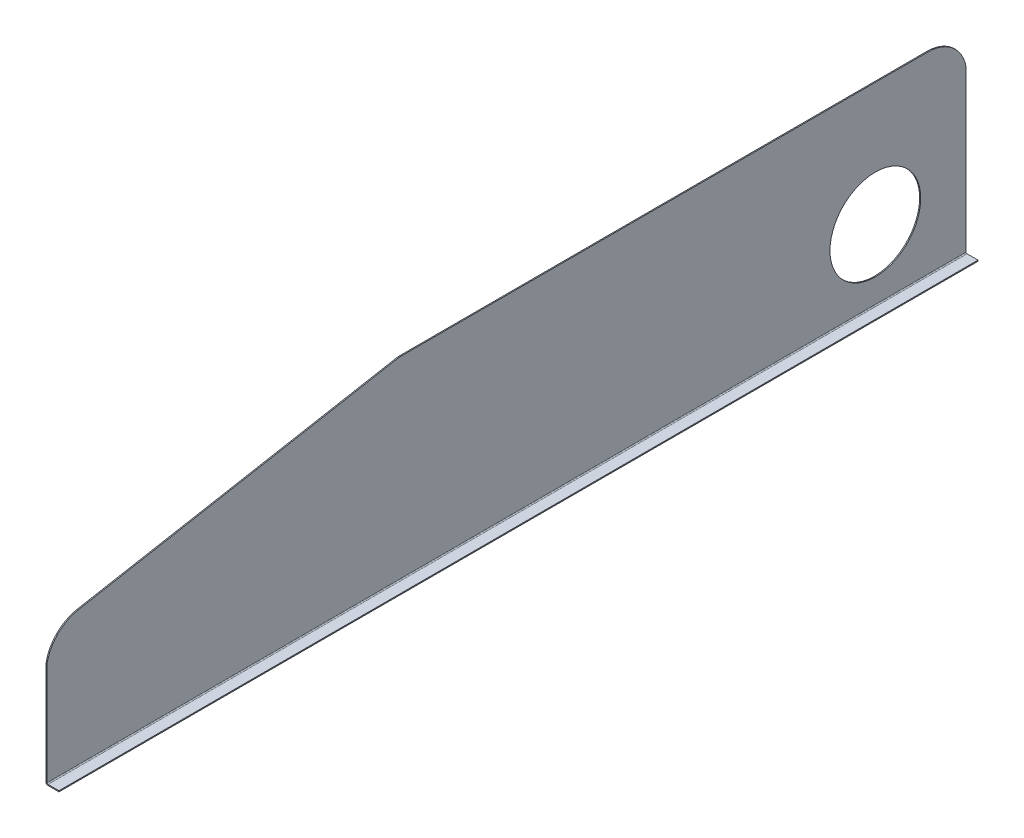
ISO-10303-21;
HEADER;
FILE_DESCRIPTION(('STEP AP214'),'2;1');
FILE_NAME('part.step','',(''),(''),'','','');
FILE_SCHEMA(('AUTOMOTIVE_DESIGN { 1 0 10303 214 1 1 1 1 }'));
ENDSEC;
DATA;
#1=APPLICATION_CONTEXT('core data for automotive mechanical design processes');
#2=APPLICATION_PROTOCOL_DEFINITION('international standard','automotive_design',2000,#1);
#3=PRODUCT_CONTEXT('',#1,'mechanical');
#4=PRODUCT('Part','Part','',(#3));
#5=PRODUCT_RELATED_PRODUCT_CATEGORY('part','',(#4));
#6=PRODUCT_DEFINITION_FORMATION('','',#4);
#7=PRODUCT_DEFINITION_CONTEXT('part definition',#1,'design');
#8=PRODUCT_DEFINITION('design','',#6,#7);
#9=PRODUCT_DEFINITION_SHAPE('','',#8);
#10=(LENGTH_UNIT() NAMED_UNIT(*) SI_UNIT(.MILLI.,.METRE.));
#11=(NAMED_UNIT(*) PLANE_ANGLE_UNIT() SI_UNIT($,.RADIAN.));
#12=(NAMED_UNIT(*) SI_UNIT($,.STERADIAN.) SOLID_ANGLE_UNIT());
#13=UNCERTAINTY_MEASURE_WITH_UNIT(LENGTH_MEASURE(1.E-05),#10,'distance_accuracy_value','');
#14=(GEOMETRIC_REPRESENTATION_CONTEXT(3) GLOBAL_UNCERTAINTY_ASSIGNED_CONTEXT((#13)) GLOBAL_UNIT_ASSIGNED_CONTEXT((#10,
#11,#12)) REPRESENTATION_CONTEXT('',''));
#15=CARTESIAN_POINT('',(0.,0.,0.));
#16=DIRECTION('',(0.,0.,1.));
#17=DIRECTION('',(1.,0.,0.));
#18=AXIS2_PLACEMENT_3D('',#15,#16,#17);
#19=CARTESIAN_POINT('',(440.45,-0.8,-354.5));
#20=DIRECTION('',(0.,-1.,0.));
#21=DIRECTION('',(0.,0.,-1.));
#22=AXIS2_PLACEMENT_3D('',#19,#20,#21);
#23=PLANE('',#22);
#24=DIRECTION('',(-1.,0.,0.));
#25=VECTOR('',#24,1.);
#26=CARTESIAN_POINT('',(-440.45,-0.8,-354.5));
#27=LINE('',#26,#25);
#28=CARTESIAN_POINT('',(-430.45,-0.8,-354.5));
#29=VERTEX_POINT('',#28);
#30=CARTESIAN_POINT('',(-438.85,-0.8,-354.5));
#31=VERTEX_POINT('',#30);
#32=EDGE_CURVE('E165',#29,#31,#27,.T.);
#33=ORIENTED_EDGE('',*,*,#32,.F.);
#34=DIRECTION('',(0.,0.,1.));
#35=VECTOR('',#34,1.);
#36=CARTESIAN_POINT('',(-430.45,-0.8,-354.5));
#37=LINE('',#36,#35);
#38=CARTESIAN_POINT('',(-430.45,-0.8,354.5));
#39=VERTEX_POINT('',#38);
#40=EDGE_CURVE('E155',#29,#39,#37,.T.);
#41=ORIENTED_EDGE('',*,*,#40,.T.);
#42=DIRECTION('',(1.,0.,0.));
#43=VECTOR('',#42,1.);
#44=CARTESIAN_POINT('',(-440.45,-0.8,354.5));
#45=LINE('',#44,#43);
#46=CARTESIAN_POINT('',(-438.85,-0.799999999999997,354.5));
#47=VERTEX_POINT('',#46);
#48=EDGE_CURVE('E82',#47,#39,#45,.T.);
#49=ORIENTED_EDGE('',*,*,#48,.F.);
#50=DIRECTION('',(0.,0.,1.));
#51=VECTOR('',#50,1.);
#52=CARTESIAN_POINT('',(-438.85,-0.799999999999997,354.5));
#53=LINE('',#52,#51);
#54=EDGE_CURVE('E201',#47,#31,#53,.F.);
#55=ORIENTED_EDGE('',*,*,#54,.T.);
#56=EDGE_LOOP('',(#33,#41,#49,#55));
#57=FACE_BOUND('',#56,.T.);
#58=ADVANCED_FACE('F73',(#57),#23,.T.);
#59=CARTESIAN_POINT('',(440.45,0.,-354.5));
#60=DIRECTION('',(0.,-1.,0.));
#61=DIRECTION('',(0.,0.,-1.));
#62=AXIS2_PLACEMENT_3D('',#59,#60,#61);
#63=PLANE('',#62);
#64=DIRECTION('',(0.,0.,1.));
#65=VECTOR('',#64,1.);
#66=CARTESIAN_POINT('',(-430.45,0.,-354.5));
#67=LINE('',#66,#65);
#68=CARTESIAN_POINT('',(-430.45,0.,-354.5));
#69=VERTEX_POINT('',#68);
#70=CARTESIAN_POINT('',(-430.45,0.,354.5));
#71=VERTEX_POINT('',#70);
#72=EDGE_CURVE('E89',#69,#71,#67,.T.);
#73=ORIENTED_EDGE('',*,*,#72,.F.);
#74=DIRECTION('',(-1.,0.,0.));
#75=VECTOR('',#74,1.);
#76=CARTESIAN_POINT('',(-440.45,0.,-354.5));
#77=LINE('',#76,#75);
#78=CARTESIAN_POINT('',(-438.85,0.,-354.5));
#79=VERTEX_POINT('',#78);
#80=EDGE_CURVE('E176',#69,#79,#77,.T.);
#81=ORIENTED_EDGE('',*,*,#80,.T.);
#82=DIRECTION('',(0.,0.,1.));
#83=VECTOR('',#82,1.);
#84=CARTESIAN_POINT('',(-438.85,0.,354.5));
#85=LINE('',#84,#83);
#86=CARTESIAN_POINT('',(-438.85,0.,354.5));
#87=VERTEX_POINT('',#86);
#88=EDGE_CURVE('E184',#87,#79,#85,.F.);
#89=ORIENTED_EDGE('',*,*,#88,.F.);
#90=DIRECTION('',(1.,0.,0.));
#91=VECTOR('',#90,1.);
#92=CARTESIAN_POINT('',(-440.45,0.,354.5));
#93=LINE('',#92,#91);
#94=EDGE_CURVE('E172',#87,#71,#93,.T.);
#95=ORIENTED_EDGE('',*,*,#94,.T.);
#96=EDGE_LOOP('',(#73,#81,#89,#95));
#97=FACE_BOUND('',#96,.T.);
#98=ADVANCED_FACE('F181',(#97),#63,.F.);
#99=CARTESIAN_POINT('',(-440.45,-0.8,-354.5));
#100=DIRECTION('',(0.,0.,-1.));
#101=DIRECTION('',(-1.,0.,0.));
#102=AXIS2_PLACEMENT_3D('',#99,#100,#101);
#103=PLANE('',#102);
#104=ORIENTED_EDGE('',*,*,#80,.F.);
#105=DIRECTION('',(0.,-1.,0.));
#106=VECTOR('',#105,1.);
#107=CARTESIAN_POINT('',(-430.45,-0.800000000000032,-354.5));
#108=LINE('',#107,#106);
#109=EDGE_CURVE('E166',#69,#29,#108,.T.);
#110=ORIENTED_EDGE('',*,*,#109,.T.);
#111=ORIENTED_EDGE('',*,*,#32,.T.);
#112=DIRECTION('',(0.,-1.,0.));
#113=VECTOR('',#112,1.);
#114=CARTESIAN_POINT('',(-438.85,0.,-354.5));
#115=LINE('',#114,#113);
#116=EDGE_CURVE('E178',#79,#31,#115,.T.);
#117=ORIENTED_EDGE('',*,*,#116,.F.);
#118=EDGE_LOOP('',(#104,#110,#111,#117));
#119=FACE_BOUND('',#118,.T.);
#120=ADVANCED_FACE('F75',(#119),#103,.T.);
#121=CARTESIAN_POINT('',(-440.45,-0.8,354.5));
#122=DIRECTION('',(0.,0.,1.));
#123=DIRECTION('',(1.,0.,0.));
#124=AXIS2_PLACEMENT_3D('',#121,#122,#123);
#125=PLANE('',#124);
#126=ORIENTED_EDGE('',*,*,#48,.T.);
#127=DIRECTION('',(0.,1.,0.));
#128=VECTOR('',#127,1.);
#129=CARTESIAN_POINT('',(-430.45,-0.800000000000032,354.5));
#130=LINE('',#129,#128);
#131=EDGE_CURVE('E13',#39,#71,#130,.T.);
#132=ORIENTED_EDGE('',*,*,#131,.T.);
#133=ORIENTED_EDGE('',*,*,#94,.F.);
#134=DIRECTION('',(0.,-1.,0.));
#135=VECTOR('',#134,1.);
#136=CARTESIAN_POINT('',(-438.85,0.,354.5));
#137=LINE('',#136,#135);
#138=EDGE_CURVE('E170',#87,#47,#137,.T.);
#139=ORIENTED_EDGE('',*,*,#138,.T.);
#140=EDGE_LOOP('',(#126,#132,#133,#139));
#141=FACE_BOUND('',#140,.T.);
#142=ADVANCED_FACE('F169',(#141),#125,.T.);
#143=CARTESIAN_POINT('',(-440.450000000001,149.2,-354.5));
#144=DIRECTION('',(1.,0.,0.));
#145=DIRECTION('',(0.,1.,0.));
#146=AXIS2_PLACEMENT_3D('',#143,#144,#145);
#147=PLANE('',#146);
#148=CARTESIAN_POINT('',(-440.45,54.2,-284.5));
#149=DIRECTION('',(-1.,0.,0.));
#150=DIRECTION('',(0.,-1.,0.));
#151=AXIS2_PLACEMENT_3D('',#148,#149,#150);
#152=CIRCLE('',#151,35.);
#153=CARTESIAN_POINT('',(-440.45,19.2,-284.5));
#154=VERTEX_POINT('',#153);
#155=EDGE_CURVE('E433',#154,#154,#152,.T.);
#156=ORIENTED_EDGE('',*,*,#155,.F.);
#157=EDGE_LOOP('',(#156));
#158=FACE_BOUND('',#157,.T.);
#159=CARTESIAN_POINT('',(-440.450000000001,119.2,-325.));
#160=DIRECTION('',(1.,0.,0.));
#161=DIRECTION('',(0.,1.,0.));
#162=AXIS2_PLACEMENT_3D('',#159,#160,#161);
#163=CIRCLE('',#162,30.);
#164=CARTESIAN_POINT('',(-440.450000000001,124.654356057318,-354.5));
#165=VERTEX_POINT('',#164);
#166=CARTESIAN_POINT('',(-440.450000000001,149.2,-325.));
#167=VERTEX_POINT('',#166);
#168=EDGE_CURVE('E225',#165,#167,#163,.T.);
#169=ORIENTED_EDGE('',*,*,#168,.F.);
#170=DIRECTION('',(0.,-1.,0.));
#171=VECTOR('',#170,1.);
#172=CARTESIAN_POINT('',(-440.450000000001,149.2,-354.5));
#173=LINE('',#172,#171);
#174=CARTESIAN_POINT('',(-440.45,0.80000000000002,-354.5));
#175=VERTEX_POINT('',#174);
#176=EDGE_CURVE('E259',#165,#175,#173,.T.);
#177=ORIENTED_EDGE('',*,*,#176,.T.);
#178=DIRECTION('',(0.,0.,1.));
#179=VECTOR('',#178,1.);
#180=CARTESIAN_POINT('',(-440.45,0.80000000000002,-354.5));
#181=LINE('',#180,#179);
#182=CARTESIAN_POINT('',(-440.45,0.800000000000021,354.5));
#183=VERTEX_POINT('',#182);
#184=EDGE_CURVE('E220',#183,#175,#181,.F.);
#185=ORIENTED_EDGE('',*,*,#184,.F.);
#186=DIRECTION('',(0.,1.,0.));
#187=VECTOR('',#186,1.);
#188=CARTESIAN_POINT('',(-440.450000000001,149.2,354.5));
#189=LINE('',#188,#187);
#190=CARTESIAN_POINT('',(-440.45,80.1961569439291,354.5));
#191=VERTEX_POINT('',#190);
#192=EDGE_CURVE('E256',#183,#191,#189,.T.);
#193=ORIENTED_EDGE('',*,*,#192,.T.);
#194=CARTESIAN_POINT('',(-440.45,74.7418008866112,325.));
#195=DIRECTION('',(1.,0.,0.));
#196=DIRECTION('',(0.,1.,0.));
#197=AXIS2_PLACEMENT_3D('',#194,#195,#196);
#198=CIRCLE('',#197,30.);
#199=CARTESIAN_POINT('',(-440.450000000001,104.258747655106,330.361888982985));
#200=VERTEX_POINT('',#199);
#201=EDGE_CURVE('E236',#191,#200,#198,.F.);
#202=ORIENTED_EDGE('',*,*,#201,.T.);
#203=DIRECTION('',(0.,0.178729632766173,-0.983898225616486));
#204=VECTOR('',#203,1.);
#205=CARTESIAN_POINT('',(-440.450000000001,226.128538062613,-340.525577646962));
#206=LINE('',#205,#204);
#207=CARTESIAN_POINT('',(-440.450000000001,149.2,82.9624076839158));
#208=VERTEX_POINT('',#207);
#209=EDGE_CURVE('E239',#200,#208,#206,.T.);
#210=ORIENTED_EDGE('',*,*,#209,.T.);
#211=DIRECTION('',(0.,0.,-1.));
#212=VECTOR('',#211,1.);
#213=CARTESIAN_POINT('',(-440.450000000001,149.2,-354.5));
#214=LINE('',#213,#212);
#215=EDGE_CURVE('E194',#208,#167,#214,.T.);
#216=ORIENTED_EDGE('',*,*,#215,.T.);
#217=EDGE_LOOP('',(#169,#177,#185,#193,#202,#210,#216));
#218=FACE_BOUND('',#217,.T.);
#219=ADVANCED_FACE('F288',(#158,#218),#147,.F.);
#220=CARTESIAN_POINT('',(-439.650000000001,149.2,-354.5));
#221=DIRECTION('',(1.,0.,0.));
#222=DIRECTION('',(0.,1.,0.));
#223=AXIS2_PLACEMENT_3D('',#220,#221,#222);
#224=PLANE('',#223);
#225=CARTESIAN_POINT('',(-439.65,54.2,-284.5));
#226=DIRECTION('',(1.,0.,0.));
#227=DIRECTION('',(0.,1.,0.));
#228=AXIS2_PLACEMENT_3D('',#225,#226,#227);
#229=CIRCLE('',#228,35.);
#230=CARTESIAN_POINT('',(-439.65,89.2,-284.5));
#231=VERTEX_POINT('',#230);
#232=EDGE_CURVE('E77',#231,#231,#229,.T.);
#233=ORIENTED_EDGE('',*,*,#232,.F.);
#234=EDGE_LOOP('',(#233));
#235=FACE_BOUND('',#234,.T.);
#236=DIRECTION('',(0.,1.,0.));
#237=VECTOR('',#236,1.);
#238=CARTESIAN_POINT('',(-439.65,0.,-354.5));
#239=LINE('',#238,#237);
#240=CARTESIAN_POINT('',(-439.650000000001,124.654356057318,-354.5));
#241=VERTEX_POINT('',#240);
#242=CARTESIAN_POINT('',(-439.65,0.800000000000023,-354.5));
#243=VERTEX_POINT('',#242);
#244=EDGE_CURVE('E267',#241,#243,#239,.F.);
#245=ORIENTED_EDGE('',*,*,#244,.F.);
#246=CARTESIAN_POINT('',(-439.650000000001,119.2,-325.));
#247=DIRECTION('',(1.,0.,0.));
#248=DIRECTION('',(0.,1.,0.));
#249=AXIS2_PLACEMENT_3D('',#246,#247,#248);
#250=CIRCLE('',#249,30.);
#251=CARTESIAN_POINT('',(-439.650000000001,149.2,-325.));
#252=VERTEX_POINT('',#251);
#253=EDGE_CURVE('E96',#241,#252,#250,.T.);
#254=ORIENTED_EDGE('',*,*,#253,.T.);
#255=DIRECTION('',(0.,0.,1.));
#256=VECTOR('',#255,1.);
#257=CARTESIAN_POINT('',(-439.650000000001,149.2,-354.5));
#258=LINE('',#257,#256);
#259=CARTESIAN_POINT('',(-439.650000000001,149.2,82.9624076839177));
#260=VERTEX_POINT('',#259);
#261=EDGE_CURVE('E261',#260,#252,#258,.F.);
#262=ORIENTED_EDGE('',*,*,#261,.F.);
#263=DIRECTION('',(0.,0.178729632766173,-0.983898225616486));
#264=VECTOR('',#263,1.);
#265=CARTESIAN_POINT('',(-439.650000000001,226.128538062613,-340.525577646962));
#266=LINE('',#265,#264);
#267=CARTESIAN_POINT('',(-439.650000000001,104.258747655106,330.361888982985));
#268=VERTEX_POINT('',#267);
#269=EDGE_CURVE('E240',#268,#260,#266,.T.);
#270=ORIENTED_EDGE('',*,*,#269,.F.);
#271=CARTESIAN_POINT('',(-439.65,74.7418008866112,325.));
#272=DIRECTION('',(1.,0.,0.));
#273=DIRECTION('',(0.,1.,0.));
#274=AXIS2_PLACEMENT_3D('',#271,#272,#273);
#275=CIRCLE('',#274,30.);
#276=CARTESIAN_POINT('',(-439.65,80.1961569439291,354.5));
#277=VERTEX_POINT('',#276);
#278=EDGE_CURVE('E234',#277,#268,#275,.F.);
#279=ORIENTED_EDGE('',*,*,#278,.F.);
#280=DIRECTION('',(0.,-1.,0.));
#281=VECTOR('',#280,1.);
#282=CARTESIAN_POINT('',(-439.650000000001,149.2,354.5));
#283=LINE('',#282,#281);
#284=CARTESIAN_POINT('',(-439.65,0.800000000000023,354.5));
#285=VERTEX_POINT('',#284);
#286=EDGE_CURVE('E264',#285,#277,#283,.F.);
#287=ORIENTED_EDGE('',*,*,#286,.F.);
#288=DIRECTION('',(0.,0.,1.));
#289=VECTOR('',#288,1.);
#290=CARTESIAN_POINT('',(-439.65,0.800000000000023,-354.5));
#291=LINE('',#290,#289);
#292=EDGE_CURVE('E271',#243,#285,#291,.T.);
#293=ORIENTED_EDGE('',*,*,#292,.F.);
#294=EDGE_LOOP('',(#245,#254,#262,#270,#279,#287,#293));
#295=FACE_BOUND('',#294,.T.);
#296=ADVANCED_FACE('F280',(#235,#295),#224,.T.);
#297=CARTESIAN_POINT('',(-440.450000000001,149.2,-354.5));
#298=DIRECTION('',(0.,-1.,0.));
#299=DIRECTION('',(1.,0.,0.));
#300=AXIS2_PLACEMENT_3D('',#297,#298,#299);
#301=PLANE('',#300);
#302=DIRECTION('',(1.,0.,0.));
#303=VECTOR('',#302,1.);
#304=CARTESIAN_POINT('',(-439.650000000001,149.2,-325.));
#305=LINE('',#304,#303);
#306=EDGE_CURVE('E231',#252,#167,#305,.F.);
#307=ORIENTED_EDGE('',*,*,#306,.T.);
#308=ORIENTED_EDGE('',*,*,#215,.F.);
#309=DIRECTION('',(1.,0.,0.));
#310=VECTOR('',#309,1.);
#311=CARTESIAN_POINT('',(-439.650000000001,149.2,82.9624076839158));
#312=LINE('',#311,#310);
#313=EDGE_CURVE('E249',#260,#208,#312,.F.);
#314=ORIENTED_EDGE('',*,*,#313,.F.);
#315=ORIENTED_EDGE('',*,*,#261,.T.);
#316=EDGE_LOOP('',(#307,#308,#314,#315));
#317=FACE_BOUND('',#316,.T.);
#318=ADVANCED_FACE('F292',(#317),#301,.F.);
#319=CARTESIAN_POINT('',(-440.45,0.,-354.5));
#320=DIRECTION('',(0.,0.,1.));
#321=DIRECTION('',(1.,0.,0.));
#322=AXIS2_PLACEMENT_3D('',#319,#320,#321);
#323=PLANE('',#322);
#324=DIRECTION('',(1.,0.,0.));
#325=VECTOR('',#324,1.);
#326=CARTESIAN_POINT('',(-439.650000000001,124.654356057318,-354.5));
#327=LINE('',#326,#325);
#328=EDGE_CURVE('E229',#241,#165,#327,.F.);
#329=ORIENTED_EDGE('',*,*,#328,.F.);
#330=ORIENTED_EDGE('',*,*,#244,.T.);
#331=DIRECTION('',(1.,0.,0.));
#332=VECTOR('',#331,1.);
#333=CARTESIAN_POINT('',(-440.45,0.80000000000002,-354.5));
#334=LINE('',#333,#332);
#335=EDGE_CURVE('E251',#243,#175,#334,.F.);
#336=ORIENTED_EDGE('',*,*,#335,.T.);
#337=ORIENTED_EDGE('',*,*,#176,.F.);
#338=EDGE_LOOP('',(#329,#330,#336,#337));
#339=FACE_BOUND('',#338,.T.);
#340=ADVANCED_FACE('F274',(#339),#323,.F.);
#341=CARTESIAN_POINT('',(-440.450000000001,149.2,354.5));
#342=DIRECTION('',(0.,0.,-1.));
#343=DIRECTION('',(-1.,0.,0.));
#344=AXIS2_PLACEMENT_3D('',#341,#342,#343);
#345=PLANE('',#344);
#346=DIRECTION('',(1.,0.,0.));
#347=VECTOR('',#346,1.);
#348=CARTESIAN_POINT('',(-439.65,80.1961569439291,354.5));
#349=LINE('',#348,#347);
#350=EDGE_CURVE('E246',#277,#191,#349,.F.);
#351=ORIENTED_EDGE('',*,*,#350,.T.);
#352=ORIENTED_EDGE('',*,*,#192,.F.);
#353=DIRECTION('',(1.,0.,0.));
#354=VECTOR('',#353,1.);
#355=CARTESIAN_POINT('',(-439.65,0.800000000000023,354.5));
#356=LINE('',#355,#354);
#357=EDGE_CURVE('E215',#285,#183,#356,.F.);
#358=ORIENTED_EDGE('',*,*,#357,.F.);
#359=ORIENTED_EDGE('',*,*,#286,.T.);
#360=EDGE_LOOP('',(#351,#352,#358,#359));
#361=FACE_BOUND('',#360,.T.);
#362=ADVANCED_FACE('F284',(#361),#345,.F.);
#363=CARTESIAN_POINT('',(-438.85,0.800000000000026,-354.5));
#364=DIRECTION('',(0.,0.,-1.));
#365=DIRECTION('',(-1.,0.,0.));
#366=AXIS2_PLACEMENT_3D('',#363,#364,#365);
#367=PLANE('',#366);
#368=ORIENTED_EDGE('',*,*,#335,.F.);
#369=CARTESIAN_POINT('',(-438.85,0.800000000000026,-354.5));
#370=DIRECTION('',(0.,0.,1.));
#371=DIRECTION('',(1.,0.,0.));
#372=AXIS2_PLACEMENT_3D('',#369,#370,#371);
#373=CIRCLE('',#372,0.800000000000023);
#374=EDGE_CURVE('E189',#79,#243,#373,.F.);
#375=ORIENTED_EDGE('',*,*,#374,.F.);
#376=ORIENTED_EDGE('',*,*,#116,.T.);
#377=CARTESIAN_POINT('',(-438.85,0.800000000000026,-354.5));
#378=DIRECTION('',(0.,0.,1.));
#379=DIRECTION('',(1.,0.,0.));
#380=AXIS2_PLACEMENT_3D('',#377,#378,#379);
#381=CIRCLE('',#380,1.60000000000002);
#382=EDGE_CURVE('E199',#31,#175,#381,.F.);
#383=ORIENTED_EDGE('',*,*,#382,.T.);
#384=EDGE_LOOP('',(#368,#375,#376,#383));
#385=FACE_BOUND('',#384,.T.);
#386=ADVANCED_FACE('F222',(#385),#367,.T.);
#387=CARTESIAN_POINT('',(-438.85,0.800000000000026,354.5));
#388=DIRECTION('',(0.,0.,-1.));
#389=DIRECTION('',(-1.,0.,0.));
#390=AXIS2_PLACEMENT_3D('',#387,#388,#389);
#391=PLANE('',#390);
#392=CARTESIAN_POINT('',(-438.85,0.800000000000026,354.5));
#393=DIRECTION('',(0.,0.,1.));
#394=DIRECTION('',(1.,0.,0.));
#395=AXIS2_PLACEMENT_3D('',#392,#393,#394);
#396=CIRCLE('',#395,0.800000000000023);
#397=EDGE_CURVE('E190',#285,#87,#396,.T.);
#398=ORIENTED_EDGE('',*,*,#397,.F.);
#399=ORIENTED_EDGE('',*,*,#357,.T.);
#400=CARTESIAN_POINT('',(-438.85,0.800000000000026,354.5));
#401=DIRECTION('',(0.,0.,1.));
#402=DIRECTION('',(1.,0.,0.));
#403=AXIS2_PLACEMENT_3D('',#400,#401,#402);
#404=CIRCLE('',#403,1.60000000000002);
#405=EDGE_CURVE('E192',#183,#47,#404,.T.);
#406=ORIENTED_EDGE('',*,*,#405,.T.);
#407=ORIENTED_EDGE('',*,*,#138,.F.);
#408=EDGE_LOOP('',(#398,#399,#406,#407));
#409=FACE_BOUND('',#408,.T.);
#410=ADVANCED_FACE('F213',(#409),#391,.F.);
#411=CARTESIAN_POINT('',(-438.85,0.800000000000026,354.5));
#412=DIRECTION('',(0.,0.,1.));
#413=DIRECTION('',(-1.,0.,0.));
#414=AXIS2_PLACEMENT_3D('',#411,#412,#413);
#415=CYLINDRICAL_SURFACE('',#414,1.60000000000002);
#416=ORIENTED_EDGE('',*,*,#54,.F.);
#417=ORIENTED_EDGE('',*,*,#405,.F.);
#418=ORIENTED_EDGE('',*,*,#184,.T.);
#419=ORIENTED_EDGE('',*,*,#382,.F.);
#420=EDGE_LOOP('',(#416,#417,#418,#419));
#421=FACE_BOUND('',#420,.T.);
#422=ADVANCED_FACE('F219',(#421),#415,.T.);
#423=CARTESIAN_POINT('',(-438.85,0.800000000000026,354.5));
#424=DIRECTION('',(0.,0.,1.));
#425=DIRECTION('',(-1.,0.,0.));
#426=AXIS2_PLACEMENT_3D('',#423,#424,#425);
#427=CYLINDRICAL_SURFACE('',#426,0.800000000000023);
#428=ORIENTED_EDGE('',*,*,#88,.T.);
#429=ORIENTED_EDGE('',*,*,#374,.T.);
#430=ORIENTED_EDGE('',*,*,#292,.T.);
#431=ORIENTED_EDGE('',*,*,#397,.T.);
#432=EDGE_LOOP('',(#428,#429,#430,#431));
#433=FACE_BOUND('',#432,.T.);
#434=ADVANCED_FACE('F277',(#433),#427,.F.);
#435=CARTESIAN_POINT('',(-439.65,74.7418008866112,325.));
#436=DIRECTION('',(1.,0.,0.));
#437=DIRECTION('',(0.,1.,0.));
#438=AXIS2_PLACEMENT_3D('',#435,#436,#437);
#439=CYLINDRICAL_SURFACE('',#438,30.);
#440=ORIENTED_EDGE('',*,*,#350,.F.);
#441=ORIENTED_EDGE('',*,*,#278,.T.);
#442=DIRECTION('',(1.,0.,0.));
#443=VECTOR('',#442,1.);
#444=CARTESIAN_POINT('',(-439.650000000001,104.258747655106,330.361888982985));
#445=LINE('',#444,#443);
#446=EDGE_CURVE('E243',#268,#200,#445,.F.);
#447=ORIENTED_EDGE('',*,*,#446,.T.);
#448=ORIENTED_EDGE('',*,*,#201,.F.);
#449=EDGE_LOOP('',(#440,#441,#447,#448));
#450=FACE_BOUND('',#449,.T.);
#451=ADVANCED_FACE('F299',(#450),#439,.T.);
#452=CARTESIAN_POINT('',(-439.650000000001,226.128538062613,-340.525577646962));
#453=DIRECTION('',(0.,-0.983898225616486,-0.178729632766173));
#454=DIRECTION('',(0.,0.178729632766173,-0.983898225616486));
#455=AXIS2_PLACEMENT_3D('',#452,#453,#454);
#456=PLANE('',#455);
#457=ORIENTED_EDGE('',*,*,#269,.T.);
#458=ORIENTED_EDGE('',*,*,#313,.T.);
#459=ORIENTED_EDGE('',*,*,#209,.F.);
#460=ORIENTED_EDGE('',*,*,#446,.F.);
#461=EDGE_LOOP('',(#457,#458,#459,#460));
#462=FACE_BOUND('',#461,.T.);
#463=ADVANCED_FACE('F297',(#462),#456,.F.);
#464=CARTESIAN_POINT('',(-439.650000000001,119.2,-325.));
#465=DIRECTION('',(1.,0.,0.));
#466=DIRECTION('',(0.,1.,0.));
#467=AXIS2_PLACEMENT_3D('',#464,#465,#466);
#468=CYLINDRICAL_SURFACE('',#467,30.);
#469=ORIENTED_EDGE('',*,*,#306,.F.);
#470=ORIENTED_EDGE('',*,*,#253,.F.);
#471=ORIENTED_EDGE('',*,*,#328,.T.);
#472=ORIENTED_EDGE('',*,*,#168,.T.);
#473=EDGE_LOOP('',(#469,#470,#471,#472));
#474=FACE_BOUND('',#473,.T.);
#475=ADVANCED_FACE('F290',(#474),#468,.T.);
#476=CARTESIAN_POINT('',(-430.450000000001,-106.590322605657,390.714626558376));
#477=DIRECTION('',(1.,0.,0.));
#478=DIRECTION('',(0.,1.,0.));
#479=AXIS2_PLACEMENT_3D('',#476,#477,#478);
#480=PLANE('',#479);
#481=ORIENTED_EDGE('',*,*,#72,.T.);
#482=ORIENTED_EDGE('',*,*,#131,.F.);
#483=ORIENTED_EDGE('',*,*,#40,.F.);
#484=ORIENTED_EDGE('',*,*,#109,.F.);
#485=EDGE_LOOP('',(#481,#482,#483,#484));
#486=FACE_BOUND('',#485,.T.);
#487=ADVANCED_FACE('F154',(#486),#480,.T.);
#488=CARTESIAN_POINT('',(-430.45,54.2,-284.5));
#489=DIRECTION('',(-1.,0.,0.));
#490=DIRECTION('',(0.,-1.,0.));
#491=AXIS2_PLACEMENT_3D('',#488,#489,#490);
#492=CYLINDRICAL_SURFACE('',#491,35.);
#493=ORIENTED_EDGE('',*,*,#232,.T.);
#494=EDGE_LOOP('',(#493));
#495=FACE_BOUND('',#494,.T.);
#496=ORIENTED_EDGE('',*,*,#155,.T.);
#497=EDGE_LOOP('',(#496));
#498=FACE_BOUND('',#497,.T.);
#499=ADVANCED_FACE('F438',(#495,#498),#492,.F.);
#500=CLOSED_SHELL('',(#58,#98,#120,#142,#219,#296,#318,#340,#362,#386,#410,#422,#434,#451,#463,
#475,#487,#499));
#501=MANIFOLD_SOLID_BREP('B2',#500);
#502=ADVANCED_BREP_SHAPE_REPRESENTATION('',(#18,#501),#14);
#503=SHAPE_DEFINITION_REPRESENTATION(#9,#502);
ENDSEC;
END-ISO-10303-21;
